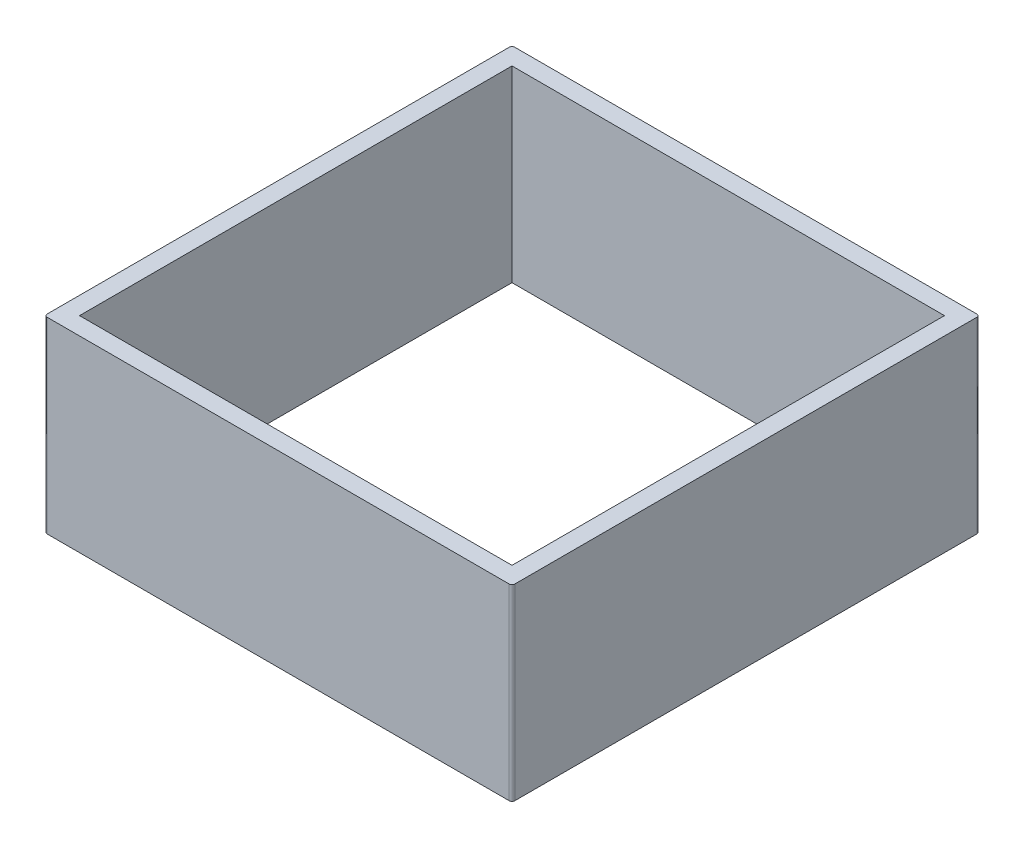
ISO-10303-21;
HEADER;
FILE_DESCRIPTION(('STEP AP214'),'2;1');
FILE_NAME('part.step','',(''),(''),'','','');
FILE_SCHEMA(('AUTOMOTIVE_DESIGN { 1 0 10303 214 1 1 1 1 }'));
ENDSEC;
DATA;
#1=APPLICATION_CONTEXT('core data for automotive mechanical design processes');
#2=APPLICATION_PROTOCOL_DEFINITION('international standard','automotive_design',2000,#1);
#3=PRODUCT_CONTEXT('',#1,'mechanical');
#4=PRODUCT('Part','Part','',(#3));
#5=PRODUCT_RELATED_PRODUCT_CATEGORY('part','',(#4));
#6=PRODUCT_DEFINITION_FORMATION('','',#4);
#7=PRODUCT_DEFINITION_CONTEXT('part definition',#1,'design');
#8=PRODUCT_DEFINITION('design','',#6,#7);
#9=PRODUCT_DEFINITION_SHAPE('','',#8);
#10=(LENGTH_UNIT() NAMED_UNIT(*) SI_UNIT(.MILLI.,.METRE.));
#11=(NAMED_UNIT(*) PLANE_ANGLE_UNIT() SI_UNIT($,.RADIAN.));
#12=(NAMED_UNIT(*) SI_UNIT($,.STERADIAN.) SOLID_ANGLE_UNIT());
#13=UNCERTAINTY_MEASURE_WITH_UNIT(LENGTH_MEASURE(1.E-05),#10,'distance_accuracy_value','');
#14=(GEOMETRIC_REPRESENTATION_CONTEXT(3) GLOBAL_UNCERTAINTY_ASSIGNED_CONTEXT((#13)) GLOBAL_UNIT_ASSIGNED_CONTEXT((#10,
#11,#12)) REPRESENTATION_CONTEXT('',''));
#15=CARTESIAN_POINT('',(0.,0.,0.));
#16=DIRECTION('',(0.,0.,1.));
#17=DIRECTION('',(1.,0.,0.));
#18=AXIS2_PLACEMENT_3D('',#15,#16,#17);
#19=CARTESIAN_POINT('',(126.238,-50.9778,0.762000000000013));
#20=DIRECTION('',(0.,-1.,0.));
#21=DIRECTION('',(0.,0.,-1.));
#22=AXIS2_PLACEMENT_3D('',#19,#20,#21);
#23=CYLINDRICAL_SURFACE('',#22,0.762);
#24=CARTESIAN_POINT('',(126.238,0.,0.762000000000013));
#25=DIRECTION('',(0.,-1.,0.));
#26=DIRECTION('',(0.,0.,-1.));
#27=AXIS2_PLACEMENT_3D('',#24,#25,#26);
#28=CIRCLE('',#27,0.762);
#29=CARTESIAN_POINT('',(126.238,0.,0.));
#30=VERTEX_POINT('',#29);
#31=CARTESIAN_POINT('',(127.,0.,0.762000000000013));
#32=VERTEX_POINT('',#31);
#33=EDGE_CURVE('E90',#30,#32,#28,.T.);
#34=ORIENTED_EDGE('',*,*,#33,.T.);
#35=DIRECTION('',(0.,1.,0.));
#36=VECTOR('',#35,1.);
#37=CARTESIAN_POINT('',(127.,-50.9778,0.762000000000013));
#38=LINE('',#37,#36);
#39=CARTESIAN_POINT('',(127.,-50.9778,0.762000000000013));
#40=VERTEX_POINT('',#39);
#41=EDGE_CURVE('E88',#40,#32,#38,.T.);
#42=ORIENTED_EDGE('',*,*,#41,.F.);
#43=CARTESIAN_POINT('',(126.238,-50.9778,0.762000000000013));
#44=DIRECTION('',(0.,-1.,0.));
#45=DIRECTION('',(0.,0.,-1.));
#46=AXIS2_PLACEMENT_3D('',#43,#44,#45);
#47=CIRCLE('',#46,0.762);
#48=CARTESIAN_POINT('',(126.238,-50.9778,0.));
#49=VERTEX_POINT('',#48);
#50=EDGE_CURVE('E20',#40,#49,#47,.F.);
#51=ORIENTED_EDGE('',*,*,#50,.T.);
#52=DIRECTION('',(0.,1.,0.));
#53=VECTOR('',#52,1.);
#54=CARTESIAN_POINT('',(126.238,-50.9778,0.));
#55=LINE('',#54,#53);
#56=EDGE_CURVE('E85',#30,#49,#55,.F.);
#57=ORIENTED_EDGE('',*,*,#56,.F.);
#58=EDGE_LOOP('',(#34,#42,#51,#57));
#59=FACE_BOUND('',#58,.T.);
#60=ADVANCED_FACE('F17',(#59),#23,.T.);
#61=CARTESIAN_POINT('',(126.238,-50.9778,126.238));
#62=DIRECTION('',(0.,-1.,0.));
#63=DIRECTION('',(0.,0.,-1.));
#64=AXIS2_PLACEMENT_3D('',#61,#62,#63);
#65=CYLINDRICAL_SURFACE('',#64,0.762);
#66=CARTESIAN_POINT('',(126.238,0.,126.238));
#67=DIRECTION('',(0.,-1.,0.));
#68=DIRECTION('',(0.,0.,-1.));
#69=AXIS2_PLACEMENT_3D('',#66,#67,#68);
#70=CIRCLE('',#69,0.762);
#71=CARTESIAN_POINT('',(127.,0.,126.238));
#72=VERTEX_POINT('',#71);
#73=CARTESIAN_POINT('',(126.238,0.,127.));
#74=VERTEX_POINT('',#73);
#75=EDGE_CURVE('E162',#72,#74,#70,.T.);
#76=ORIENTED_EDGE('',*,*,#75,.T.);
#77=DIRECTION('',(0.,1.,0.));
#78=VECTOR('',#77,1.);
#79=CARTESIAN_POINT('',(126.238,-50.9778,127.));
#80=LINE('',#79,#78);
#81=CARTESIAN_POINT('',(126.238,-50.9778,127.));
#82=VERTEX_POINT('',#81);
#83=EDGE_CURVE('E143',#82,#74,#80,.T.);
#84=ORIENTED_EDGE('',*,*,#83,.F.);
#85=CARTESIAN_POINT('',(126.238,-50.9778,126.238));
#86=DIRECTION('',(0.,-1.,0.));
#87=DIRECTION('',(0.,0.,-1.));
#88=AXIS2_PLACEMENT_3D('',#85,#86,#87);
#89=CIRCLE('',#88,0.762);
#90=CARTESIAN_POINT('',(127.,-50.9778,126.238));
#91=VERTEX_POINT('',#90);
#92=EDGE_CURVE('E173',#82,#91,#89,.F.);
#93=ORIENTED_EDGE('',*,*,#92,.T.);
#94=DIRECTION('',(0.,1.,0.));
#95=VECTOR('',#94,1.);
#96=CARTESIAN_POINT('',(127.,-50.9778,126.238));
#97=LINE('',#96,#95);
#98=EDGE_CURVE('E159',#72,#91,#97,.F.);
#99=ORIENTED_EDGE('',*,*,#98,.F.);
#100=EDGE_LOOP('',(#76,#84,#93,#99));
#101=FACE_BOUND('',#100,.T.);
#102=ADVANCED_FACE('F184',(#101),#65,.T.);
#103=CARTESIAN_POINT('',(127.,-50.9778,127.));
#104=DIRECTION('',(1.,0.,0.));
#105=DIRECTION('',(0.,0.,-1.));
#106=AXIS2_PLACEMENT_3D('',#103,#104,#105);
#107=PLANE('',#106);
#108=DIRECTION('',(0.,0.,1.));
#109=VECTOR('',#108,1.);
#110=CARTESIAN_POINT('',(127.,-50.9778,127.));
#111=LINE('',#110,#109);
#112=EDGE_CURVE('E102',#91,#40,#111,.F.);
#113=ORIENTED_EDGE('',*,*,#112,.T.);
#114=ORIENTED_EDGE('',*,*,#41,.T.);
#115=DIRECTION('',(0.,0.,1.));
#116=VECTOR('',#115,1.);
#117=CARTESIAN_POINT('',(127.,0.,127.));
#118=LINE('',#117,#116);
#119=EDGE_CURVE('E136',#72,#32,#118,.F.);
#120=ORIENTED_EDGE('',*,*,#119,.F.);
#121=ORIENTED_EDGE('',*,*,#98,.T.);
#122=EDGE_LOOP('',(#113,#114,#120,#121));
#123=FACE_BOUND('',#122,.T.);
#124=ADVANCED_FACE('F177',(#123),#107,.T.);
#125=CARTESIAN_POINT('',(127.,-50.9778,0.));
#126=DIRECTION('',(0.,0.,-1.));
#127=DIRECTION('',(-1.,0.,0.));
#128=AXIS2_PLACEMENT_3D('',#125,#126,#127);
#129=PLANE('',#128);
#130=DIRECTION('',(1.,0.,0.));
#131=VECTOR('',#130,1.);
#132=CARTESIAN_POINT('',(0.,0.,0.));
#133=LINE('',#132,#131);
#134=CARTESIAN_POINT('',(0.762000000000013,0.,0.));
#135=VERTEX_POINT('',#134);
#136=EDGE_CURVE('E96',#30,#135,#133,.F.);
#137=ORIENTED_EDGE('',*,*,#136,.F.);
#138=ORIENTED_EDGE('',*,*,#56,.T.);
#139=DIRECTION('',(1.,0.,0.));
#140=VECTOR('',#139,1.);
#141=CARTESIAN_POINT('',(0.,-50.9778,0.));
#142=LINE('',#141,#140);
#143=CARTESIAN_POINT('',(0.762000000000013,-50.9778,0.));
#144=VERTEX_POINT('',#143);
#145=EDGE_CURVE('E94',#49,#144,#142,.F.);
#146=ORIENTED_EDGE('',*,*,#145,.T.);
#147=DIRECTION('',(0.,-1.,0.));
#148=VECTOR('',#147,1.);
#149=CARTESIAN_POINT('',(0.762000000000013,-50.9778,0.));
#150=LINE('',#149,#148);
#151=EDGE_CURVE('E113',#135,#144,#150,.T.);
#152=ORIENTED_EDGE('',*,*,#151,.F.);
#153=EDGE_LOOP('',(#137,#138,#146,#152));
#154=FACE_BOUND('',#153,.T.);
#155=ADVANCED_FACE('F92',(#154),#129,.T.);
#156=CARTESIAN_POINT('',(122.2248,135.721787821827,4.77520000000002));
#157=DIRECTION('',(0.,0.,1.));
#158=DIRECTION('',(1.,0.,0.));
#159=AXIS2_PLACEMENT_3D('',#156,#157,#158);
#160=PLANE('',#159);
#161=DIRECTION('',(0.,1.,0.));
#162=VECTOR('',#161,1.);
#163=CARTESIAN_POINT('',(122.2248,135.721787821827,4.77520000000002));
#164=LINE('',#163,#162);
#165=CARTESIAN_POINT('',(122.2248,0.,4.77520000000002));
#166=VERTEX_POINT('',#165);
#167=CARTESIAN_POINT('',(122.2248,-50.9778,4.77520000000002));
#168=VERTEX_POINT('',#167);
#169=EDGE_CURVE('E97',#166,#168,#164,.F.);
#170=ORIENTED_EDGE('',*,*,#169,.F.);
#171=DIRECTION('',(1.,0.,0.));
#172=VECTOR('',#171,1.);
#173=CARTESIAN_POINT('',(0.,0.,4.77520000000001));
#174=LINE('',#173,#172);
#175=CARTESIAN_POINT('',(4.77519999999999,0.,4.77520000000001));
#176=VERTEX_POINT('',#175);
#177=EDGE_CURVE('E127',#176,#166,#174,.T.);
#178=ORIENTED_EDGE('',*,*,#177,.F.);
#179=DIRECTION('',(0.,1.,0.));
#180=VECTOR('',#179,1.);
#181=CARTESIAN_POINT('',(4.77519999999999,135.721787821827,4.77520000000001));
#182=LINE('',#181,#180);
#183=CARTESIAN_POINT('',(4.7752,-50.9778,4.77520000000001));
#184=VERTEX_POINT('',#183);
#185=EDGE_CURVE('E147',#184,#176,#182,.T.);
#186=ORIENTED_EDGE('',*,*,#185,.F.);
#187=DIRECTION('',(1.,0.,0.));
#188=VECTOR('',#187,1.);
#189=CARTESIAN_POINT('',(0.,-50.9778,4.77520000000001));
#190=LINE('',#189,#188);
#191=EDGE_CURVE('E104',#184,#168,#190,.T.);
#192=ORIENTED_EDGE('',*,*,#191,.T.);
#193=EDGE_LOOP('',(#170,#178,#186,#192));
#194=FACE_BOUND('',#193,.T.);
#195=ADVANCED_FACE('F233',(#194),#160,.T.);
#196=CARTESIAN_POINT('',(122.2248,135.721787821827,122.2248));
#197=DIRECTION('',(-1.,0.,0.));
#198=DIRECTION('',(0.,0.,1.));
#199=AXIS2_PLACEMENT_3D('',#196,#197,#198);
#200=PLANE('',#199);
#201=DIRECTION('',(0.,1.,0.));
#202=VECTOR('',#201,1.);
#203=CARTESIAN_POINT('',(122.2248,135.721787821827,122.2248));
#204=LINE('',#203,#202);
#205=CARTESIAN_POINT('',(122.2248,0.,122.2248));
#206=VERTEX_POINT('',#205);
#207=CARTESIAN_POINT('',(122.2248,-50.9778,122.2248));
#208=VERTEX_POINT('',#207);
#209=EDGE_CURVE('E153',#206,#208,#204,.F.);
#210=ORIENTED_EDGE('',*,*,#209,.F.);
#211=DIRECTION('',(0.,0.,1.));
#212=VECTOR('',#211,1.);
#213=CARTESIAN_POINT('',(122.2248,0.,127.));
#214=LINE('',#213,#212);
#215=EDGE_CURVE('E123',#166,#206,#214,.T.);
#216=ORIENTED_EDGE('',*,*,#215,.F.);
#217=ORIENTED_EDGE('',*,*,#169,.T.);
#218=DIRECTION('',(0.,0.,1.));
#219=VECTOR('',#218,1.);
#220=CARTESIAN_POINT('',(122.2248,-50.9778,127.));
#221=LINE('',#220,#219);
#222=EDGE_CURVE('E224',#168,#208,#221,.T.);
#223=ORIENTED_EDGE('',*,*,#222,.T.);
#224=EDGE_LOOP('',(#210,#216,#217,#223));
#225=FACE_BOUND('',#224,.T.);
#226=ADVANCED_FACE('F236',(#225),#200,.T.);
#227=CARTESIAN_POINT('',(4.77519999999999,135.721787821827,122.2248));
#228=DIRECTION('',(0.,0.,-1.));
#229=DIRECTION('',(-1.,0.,0.));
#230=AXIS2_PLACEMENT_3D('',#227,#228,#229);
#231=PLANE('',#230);
#232=DIRECTION('',(0.,1.,0.));
#233=VECTOR('',#232,1.);
#234=CARTESIAN_POINT('',(4.77519999999999,135.721787821827,122.2248));
#235=LINE('',#234,#233);
#236=CARTESIAN_POINT('',(4.77519999999999,0.,122.2248));
#237=VERTEX_POINT('',#236);
#238=CARTESIAN_POINT('',(4.77519999999999,-50.9778,122.2248));
#239=VERTEX_POINT('',#238);
#240=EDGE_CURVE('E150',#237,#239,#235,.F.);
#241=ORIENTED_EDGE('',*,*,#240,.F.);
#242=DIRECTION('',(1.,0.,0.));
#243=VECTOR('',#242,1.);
#244=CARTESIAN_POINT('',(0.,0.,122.2248));
#245=LINE('',#244,#243);
#246=EDGE_CURVE('E133',#206,#237,#245,.F.);
#247=ORIENTED_EDGE('',*,*,#246,.F.);
#248=ORIENTED_EDGE('',*,*,#209,.T.);
#249=DIRECTION('',(1.,0.,0.));
#250=VECTOR('',#249,1.);
#251=CARTESIAN_POINT('',(0.,-50.9778,122.2248));
#252=LINE('',#251,#250);
#253=EDGE_CURVE('E217',#208,#239,#252,.F.);
#254=ORIENTED_EDGE('',*,*,#253,.T.);
#255=EDGE_LOOP('',(#241,#247,#248,#254));
#256=FACE_BOUND('',#255,.T.);
#257=ADVANCED_FACE('F218',(#256),#231,.T.);
#258=CARTESIAN_POINT('',(4.77519999999999,135.721787821827,4.77520000000001));
#259=DIRECTION('',(1.,0.,0.));
#260=DIRECTION('',(0.,0.,-1.));
#261=AXIS2_PLACEMENT_3D('',#258,#259,#260);
#262=PLANE('',#261);
#263=ORIENTED_EDGE('',*,*,#185,.T.);
#264=DIRECTION('',(0.,0.,1.));
#265=VECTOR('',#264,1.);
#266=CARTESIAN_POINT('',(4.77519999999999,0.,127.));
#267=LINE('',#266,#265);
#268=EDGE_CURVE('E130',#237,#176,#267,.F.);
#269=ORIENTED_EDGE('',*,*,#268,.F.);
#270=ORIENTED_EDGE('',*,*,#240,.T.);
#271=DIRECTION('',(0.,0.,1.));
#272=VECTOR('',#271,1.);
#273=CARTESIAN_POINT('',(4.77519999999999,-50.9778,127.));
#274=LINE('',#273,#272);
#275=EDGE_CURVE('E168',#239,#184,#274,.F.);
#276=ORIENTED_EDGE('',*,*,#275,.T.);
#277=EDGE_LOOP('',(#263,#269,#270,#276));
#278=FACE_BOUND('',#277,.T.);
#279=ADVANCED_FACE('F228',(#278),#262,.T.);
#280=CARTESIAN_POINT('',(0.,-50.9778,127.));
#281=DIRECTION('',(0.,0.,1.));
#282=DIRECTION('',(1.,0.,0.));
#283=AXIS2_PLACEMENT_3D('',#280,#281,#282);
#284=PLANE('',#283);
#285=DIRECTION('',(1.,0.,0.));
#286=VECTOR('',#285,1.);
#287=CARTESIAN_POINT('',(0.,0.,127.));
#288=LINE('',#287,#286);
#289=CARTESIAN_POINT('',(0.762,0.,127.));
#290=VERTEX_POINT('',#289);
#291=EDGE_CURVE('E139',#290,#74,#288,.T.);
#292=ORIENTED_EDGE('',*,*,#291,.F.);
#293=DIRECTION('',(0.,-1.,0.));
#294=VECTOR('',#293,1.);
#295=CARTESIAN_POINT('',(0.762,-50.9778,127.));
#296=LINE('',#295,#294);
#297=CARTESIAN_POINT('',(0.762,-50.9778,127.));
#298=VERTEX_POINT('',#297);
#299=EDGE_CURVE('E144',#298,#290,#296,.F.);
#300=ORIENTED_EDGE('',*,*,#299,.F.);
#301=DIRECTION('',(1.,0.,0.));
#302=VECTOR('',#301,1.);
#303=CARTESIAN_POINT('',(0.,-50.9778,127.));
#304=LINE('',#303,#302);
#305=EDGE_CURVE('E106',#298,#82,#304,.T.);
#306=ORIENTED_EDGE('',*,*,#305,.T.);
#307=ORIENTED_EDGE('',*,*,#83,.T.);
#308=EDGE_LOOP('',(#292,#300,#306,#307));
#309=FACE_BOUND('',#308,.T.);
#310=ADVANCED_FACE('F187',(#309),#284,.T.);
#311=CARTESIAN_POINT('',(0.,0.,127.));
#312=DIRECTION('',(0.,1.,0.));
#313=DIRECTION('',(0.,0.,1.));
#314=AXIS2_PLACEMENT_3D('',#311,#312,#313);
#315=PLANE('',#314);
#316=ORIENTED_EDGE('',*,*,#177,.T.);
#317=ORIENTED_EDGE('',*,*,#215,.T.);
#318=ORIENTED_EDGE('',*,*,#246,.T.);
#319=ORIENTED_EDGE('',*,*,#268,.T.);
#320=EDGE_LOOP('',(#316,#317,#318,#319));
#321=FACE_BOUND('',#320,.T.);
#322=ORIENTED_EDGE('',*,*,#119,.T.);
#323=ORIENTED_EDGE('',*,*,#33,.F.);
#324=ORIENTED_EDGE('',*,*,#136,.T.);
#325=CARTESIAN_POINT('',(0.762000000000013,0.,0.762000000000007));
#326=DIRECTION('',(0.,-1.,0.));
#327=DIRECTION('',(0.,0.,-1.));
#328=AXIS2_PLACEMENT_3D('',#325,#326,#327);
#329=CIRCLE('',#328,0.762);
#330=CARTESIAN_POINT('',(0.,0.,0.762000000000007));
#331=VERTEX_POINT('',#330);
#332=EDGE_CURVE('E126',#331,#135,#329,.T.);
#333=ORIENTED_EDGE('',*,*,#332,.F.);
#334=DIRECTION('',(0.,0.,1.));
#335=VECTOR('',#334,1.);
#336=CARTESIAN_POINT('',(0.,0.,0.));
#337=LINE('',#336,#335);
#338=CARTESIAN_POINT('',(0.,0.,126.238));
#339=VERTEX_POINT('',#338);
#340=EDGE_CURVE('E117',#339,#331,#337,.F.);
#341=ORIENTED_EDGE('',*,*,#340,.F.);
#342=CARTESIAN_POINT('',(0.762,0.,126.238));
#343=DIRECTION('',(0.,-1.,0.));
#344=DIRECTION('',(0.,0.,-1.));
#345=AXIS2_PLACEMENT_3D('',#342,#343,#344);
#346=CIRCLE('',#345,0.762);
#347=EDGE_CURVE('E122',#290,#339,#346,.T.);
#348=ORIENTED_EDGE('',*,*,#347,.F.);
#349=ORIENTED_EDGE('',*,*,#291,.T.);
#350=ORIENTED_EDGE('',*,*,#75,.F.);
#351=EDGE_LOOP('',(#322,#323,#324,#333,#341,#348,#349,#350));
#352=FACE_BOUND('',#351,.T.);
#353=ADVANCED_FACE('F178',(#321,#352),#315,.T.);
#354=CARTESIAN_POINT('',(0.762000000000013,-50.9778,0.762000000000007));
#355=DIRECTION('',(0.,-1.,0.));
#356=DIRECTION('',(0.,0.,-1.));
#357=AXIS2_PLACEMENT_3D('',#354,#355,#356);
#358=CYLINDRICAL_SURFACE('',#357,0.762);
#359=ORIENTED_EDGE('',*,*,#332,.T.);
#360=ORIENTED_EDGE('',*,*,#151,.T.);
#361=CARTESIAN_POINT('',(0.762000000000013,-50.9778,0.762000000000007));
#362=DIRECTION('',(0.,-1.,0.));
#363=DIRECTION('',(0.,0.,-1.));
#364=AXIS2_PLACEMENT_3D('',#361,#362,#363);
#365=CIRCLE('',#364,0.762);
#366=CARTESIAN_POINT('',(0.,-50.9778,0.762000000000007));
#367=VERTEX_POINT('',#366);
#368=EDGE_CURVE('E101',#144,#367,#365,.F.);
#369=ORIENTED_EDGE('',*,*,#368,.T.);
#370=DIRECTION('',(0.,1.,0.));
#371=VECTOR('',#370,1.);
#372=CARTESIAN_POINT('',(0.,-50.9778,0.762000000000007));
#373=LINE('',#372,#371);
#374=EDGE_CURVE('E114',#331,#367,#373,.F.);
#375=ORIENTED_EDGE('',*,*,#374,.F.);
#376=EDGE_LOOP('',(#359,#360,#369,#375));
#377=FACE_BOUND('',#376,.T.);
#378=ADVANCED_FACE('F195',(#377),#358,.T.);
#379=CARTESIAN_POINT('',(0.,-50.9778,127.));
#380=DIRECTION('',(0.,1.,0.));
#381=DIRECTION('',(0.,0.,1.));
#382=AXIS2_PLACEMENT_3D('',#379,#380,#381);
#383=PLANE('',#382);
#384=ORIENTED_EDGE('',*,*,#253,.F.);
#385=ORIENTED_EDGE('',*,*,#222,.F.);
#386=ORIENTED_EDGE('',*,*,#191,.F.);
#387=ORIENTED_EDGE('',*,*,#275,.F.);
#388=EDGE_LOOP('',(#384,#385,#386,#387));
#389=FACE_BOUND('',#388,.T.);
#390=ORIENTED_EDGE('',*,*,#368,.F.);
#391=ORIENTED_EDGE('',*,*,#145,.F.);
#392=ORIENTED_EDGE('',*,*,#50,.F.);
#393=ORIENTED_EDGE('',*,*,#112,.F.);
#394=ORIENTED_EDGE('',*,*,#92,.F.);
#395=ORIENTED_EDGE('',*,*,#305,.F.);
#396=CARTESIAN_POINT('',(0.762,-50.9778,126.238));
#397=DIRECTION('',(0.,-1.,0.));
#398=DIRECTION('',(0.,0.,-1.));
#399=AXIS2_PLACEMENT_3D('',#396,#397,#398);
#400=CIRCLE('',#399,0.762);
#401=CARTESIAN_POINT('',(0.,-50.9778,126.238));
#402=VERTEX_POINT('',#401);
#403=EDGE_CURVE('E35',#402,#298,#400,.F.);
#404=ORIENTED_EDGE('',*,*,#403,.F.);
#405=DIRECTION('',(0.,0.,1.));
#406=VECTOR('',#405,1.);
#407=CARTESIAN_POINT('',(0.,-50.9778,0.));
#408=LINE('',#407,#406);
#409=EDGE_CURVE('E26',#367,#402,#408,.T.);
#410=ORIENTED_EDGE('',*,*,#409,.F.);
#411=EDGE_LOOP('',(#390,#391,#392,#393,#394,#395,#404,#410));
#412=FACE_BOUND('',#411,.T.);
#413=ADVANCED_FACE('F100',(#389,#412),#383,.F.);
#414=CARTESIAN_POINT('',(0.762,-50.9778,126.238));
#415=DIRECTION('',(0.,-1.,0.));
#416=DIRECTION('',(0.,0.,-1.));
#417=AXIS2_PLACEMENT_3D('',#414,#415,#416);
#418=CYLINDRICAL_SURFACE('',#417,0.762);
#419=ORIENTED_EDGE('',*,*,#347,.T.);
#420=DIRECTION('',(0.,1.,0.));
#421=VECTOR('',#420,1.);
#422=CARTESIAN_POINT('',(0.,-50.9778,126.238));
#423=LINE('',#422,#421);
#424=EDGE_CURVE('E11',#402,#339,#423,.T.);
#425=ORIENTED_EDGE('',*,*,#424,.F.);
#426=ORIENTED_EDGE('',*,*,#403,.T.);
#427=ORIENTED_EDGE('',*,*,#299,.T.);
#428=EDGE_LOOP('',(#419,#425,#426,#427));
#429=FACE_BOUND('',#428,.T.);
#430=ADVANCED_FACE('F189',(#429),#418,.T.);
#431=CARTESIAN_POINT('',(0.,-50.9778,0.));
#432=DIRECTION('',(-1.,0.,0.));
#433=DIRECTION('',(0.,0.,1.));
#434=AXIS2_PLACEMENT_3D('',#431,#432,#433);
#435=PLANE('',#434);
#436=ORIENTED_EDGE('',*,*,#409,.T.);
#437=ORIENTED_EDGE('',*,*,#424,.T.);
#438=ORIENTED_EDGE('',*,*,#340,.T.);
#439=ORIENTED_EDGE('',*,*,#374,.T.);
#440=EDGE_LOOP('',(#436,#437,#438,#439));
#441=FACE_BOUND('',#440,.T.);
#442=ADVANCED_FACE('F191',(#441),#435,.T.);
#443=CLOSED_SHELL('',(#60,#102,#124,#155,#195,#226,#257,#279,#310,#353,#378,#413,#430,#442));
#444=MANIFOLD_SOLID_BREP('B1',#443);
#445=ADVANCED_BREP_SHAPE_REPRESENTATION('',(#18,#444),#14);
#446=SHAPE_DEFINITION_REPRESENTATION(#9,#445);
ENDSEC;
END-ISO-10303-21;
